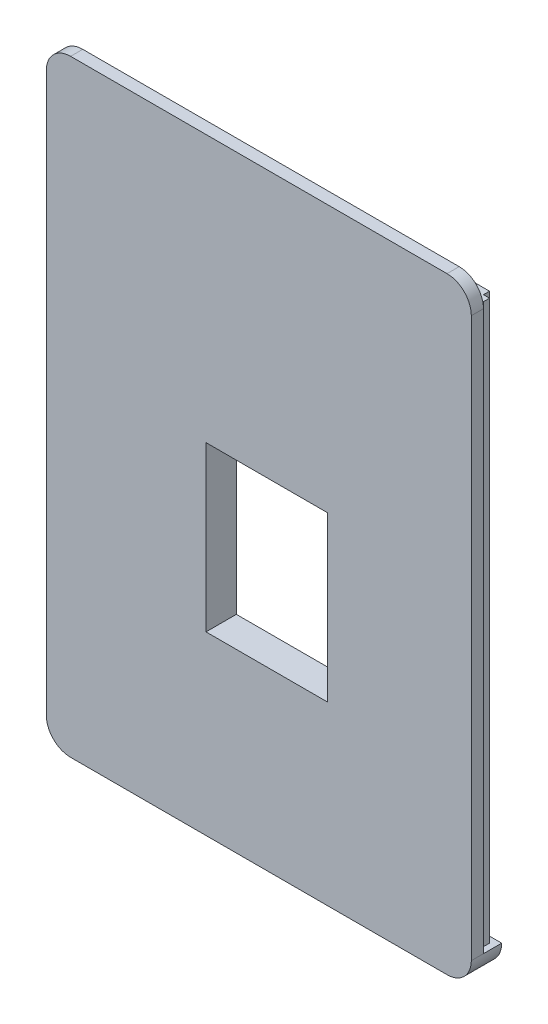
ISO-10303-21;
HEADER;
FILE_DESCRIPTION(('STEP AP214'),'2;1');
FILE_NAME('part.step','',(''),(''),'','','');
FILE_SCHEMA(('AUTOMOTIVE_DESIGN { 1 0 10303 214 1 1 1 1 }'));
ENDSEC;
DATA;
#1=APPLICATION_CONTEXT('core data for automotive mechanical design processes');
#2=APPLICATION_PROTOCOL_DEFINITION('international standard','automotive_design',2000,#1);
#3=PRODUCT_CONTEXT('',#1,'mechanical');
#4=PRODUCT('Part','Part','',(#3));
#5=PRODUCT_RELATED_PRODUCT_CATEGORY('part','',(#4));
#6=PRODUCT_DEFINITION_FORMATION('','',#4);
#7=PRODUCT_DEFINITION_CONTEXT('part definition',#1,'design');
#8=PRODUCT_DEFINITION('design','',#6,#7);
#9=PRODUCT_DEFINITION_SHAPE('','',#8);
#10=(LENGTH_UNIT() NAMED_UNIT(*) SI_UNIT(.MILLI.,.METRE.));
#11=(NAMED_UNIT(*) PLANE_ANGLE_UNIT() SI_UNIT($,.RADIAN.));
#12=(NAMED_UNIT(*) SI_UNIT($,.STERADIAN.) SOLID_ANGLE_UNIT());
#13=UNCERTAINTY_MEASURE_WITH_UNIT(LENGTH_MEASURE(1.E-05),#10,'distance_accuracy_value','');
#14=(GEOMETRIC_REPRESENTATION_CONTEXT(3) GLOBAL_UNCERTAINTY_ASSIGNED_CONTEXT((#13)) GLOBAL_UNIT_ASSIGNED_CONTEXT((#10,
#11,#12)) REPRESENTATION_CONTEXT('',''));
#15=CARTESIAN_POINT('',(0.,0.,0.));
#16=DIRECTION('',(0.,0.,1.));
#17=DIRECTION('',(1.,0.,0.));
#18=AXIS2_PLACEMENT_3D('',#15,#16,#17);
#19=CARTESIAN_POINT('',(0.,0.,0.));
#20=DIRECTION('',(0.,0.,-1.));
#21=DIRECTION('',(-1.,0.,0.));
#22=AXIS2_PLACEMENT_3D('',#19,#20,#21);
#23=PLANE('',#22);
#24=DIRECTION('',(0.,-1.,0.));
#25=VECTOR('',#24,1.);
#26=CARTESIAN_POINT('',(11.3,6.05,0.));
#27=LINE('',#26,#25);
#28=CARTESIAN_POINT('',(11.3,6.05,0.));
#29=VERTEX_POINT('',#28);
#30=CARTESIAN_POINT('',(11.3,-20.95,0.));
#31=VERTEX_POINT('',#30);
#32=EDGE_CURVE('E306',#29,#31,#27,.T.);
#33=ORIENTED_EDGE('',*,*,#32,.F.);
#34=DIRECTION('',(1.,0.,0.));
#35=VECTOR('',#34,1.);
#36=CARTESIAN_POINT('',(-8.7,6.05,0.));
#37=LINE('',#36,#35);
#38=CARTESIAN_POINT('',(-8.7,6.05,0.));
#39=VERTEX_POINT('',#38);
#40=EDGE_CURVE('E294',#39,#29,#37,.T.);
#41=ORIENTED_EDGE('',*,*,#40,.F.);
#42=DIRECTION('',(0.,1.,0.));
#43=VECTOR('',#42,1.);
#44=CARTESIAN_POINT('',(-8.7,6.05,0.));
#45=LINE('',#44,#43);
#46=CARTESIAN_POINT('',(-8.7,-20.95,0.));
#47=VERTEX_POINT('',#46);
#48=EDGE_CURVE('E314',#47,#39,#45,.T.);
#49=ORIENTED_EDGE('',*,*,#48,.F.);
#50=DIRECTION('',(-1.,0.,0.));
#51=VECTOR('',#50,1.);
#52=CARTESIAN_POINT('',(-8.7,-20.95,0.));
#53=LINE('',#52,#51);
#54=EDGE_CURVE('E309',#31,#47,#53,.T.);
#55=ORIENTED_EDGE('',*,*,#54,.F.);
#56=EDGE_LOOP('',(#33,#41,#49,#55));
#57=FACE_BOUND('',#56,.T.);
#58=DIRECTION('',(0.,1.,0.));
#59=VECTOR('',#58,1.);
#60=CARTESIAN_POINT('',(-33.,-46.,0.));
#61=LINE('',#60,#59);
#62=CARTESIAN_POINT('',(-33.,-46.,0.));
#63=VERTEX_POINT('',#62);
#64=CARTESIAN_POINT('',(-33.,46.,0.));
#65=VERTEX_POINT('',#64);
#66=EDGE_CURVE('E260',#63,#65,#61,.T.);
#67=ORIENTED_EDGE('',*,*,#66,.T.);
#68=DIRECTION('',(-1.,0.,0.));
#69=VECTOR('',#68,1.);
#70=CARTESIAN_POINT('',(35.,46.,0.));
#71=LINE('',#70,#69);
#72=CARTESIAN_POINT('',(33.,46.,0.));
#73=VERTEX_POINT('',#72);
#74=EDGE_CURVE('E230',#73,#65,#71,.T.);
#75=ORIENTED_EDGE('',*,*,#74,.F.);
#76=DIRECTION('',(0.,1.,0.));
#77=VECTOR('',#76,1.);
#78=CARTESIAN_POINT('',(33.,-46.,0.));
#79=LINE('',#78,#77);
#80=CARTESIAN_POINT('',(33.,-46.,0.));
#81=VERTEX_POINT('',#80);
#82=EDGE_CURVE('E445',#81,#73,#79,.T.);
#83=ORIENTED_EDGE('',*,*,#82,.F.);
#84=DIRECTION('',(-1.,0.,0.));
#85=VECTOR('',#84,1.);
#86=CARTESIAN_POINT('',(35.,-46.,0.));
#87=LINE('',#86,#85);
#88=CARTESIAN_POINT('',(35.,-46.,0.));
#89=VERTEX_POINT('',#88);
#90=EDGE_CURVE('E466',#89,#81,#87,.T.);
#91=ORIENTED_EDGE('',*,*,#90,.F.);
#92=CARTESIAN_POINT('',(31.,-46.,0.));
#93=DIRECTION('',(0.,0.,-1.));
#94=DIRECTION('',(-1.,0.,0.));
#95=AXIS2_PLACEMENT_3D('',#92,#93,#94);
#96=CIRCLE('',#95,4.);
#97=CARTESIAN_POINT('',(31.,-50.,0.));
#98=VERTEX_POINT('',#97);
#99=EDGE_CURVE('E360',#89,#98,#96,.T.);
#100=ORIENTED_EDGE('',*,*,#99,.T.);
#101=DIRECTION('',(1.,0.,0.));
#102=VECTOR('',#101,1.);
#103=CARTESIAN_POINT('',(35.,-50.,0.));
#104=LINE('',#103,#102);
#105=CARTESIAN_POINT('',(-31.,-50.,0.));
#106=VERTEX_POINT('',#105);
#107=EDGE_CURVE('E324',#106,#98,#104,.T.);
#108=ORIENTED_EDGE('',*,*,#107,.F.);
#109=CARTESIAN_POINT('',(-31.,-46.,0.));
#110=DIRECTION('',(0.,0.,-1.));
#111=DIRECTION('',(-1.,0.,0.));
#112=AXIS2_PLACEMENT_3D('',#109,#110,#111);
#113=CIRCLE('',#112,4.);
#114=CARTESIAN_POINT('',(-35.,-46.,0.));
#115=VERTEX_POINT('',#114);
#116=EDGE_CURVE('E363',#106,#115,#113,.T.);
#117=ORIENTED_EDGE('',*,*,#116,.T.);
#118=DIRECTION('',(-1.,0.,0.));
#119=VECTOR('',#118,1.);
#120=CARTESIAN_POINT('',(-35.,-46.,0.));
#121=LINE('',#120,#119);
#122=EDGE_CURVE('E285',#63,#115,#121,.T.);
#123=ORIENTED_EDGE('',*,*,#122,.F.);
#124=EDGE_LOOP('',(#67,#75,#83,#91,#100,#108,#117,#123));
#125=FACE_BOUND('',#124,.T.);
#126=ADVANCED_FACE('F45',(#57,#125),#23,.T.);
#127=CARTESIAN_POINT('',(-33.,-46.,0.));
#128=DIRECTION('',(1.,0.,0.));
#129=DIRECTION('',(0.,0.,-1.));
#130=AXIS2_PLACEMENT_3D('',#127,#128,#129);
#131=PLANE('',#130);
#132=DIRECTION('',(0.,0.,1.));
#133=VECTOR('',#132,1.);
#134=CARTESIAN_POINT('',(-33.,46.,0.));
#135=LINE('',#134,#133);
#136=CARTESIAN_POINT('',(-33.,46.,1.));
#137=VERTEX_POINT('',#136);
#138=EDGE_CURVE('E264',#65,#137,#135,.T.);
#139=ORIENTED_EDGE('',*,*,#138,.F.);
#140=ORIENTED_EDGE('',*,*,#66,.F.);
#141=DIRECTION('',(0.,0.,-1.));
#142=VECTOR('',#141,1.);
#143=CARTESIAN_POINT('',(-33.,-46.,0.));
#144=LINE('',#143,#142);
#145=CARTESIAN_POINT('',(-33.,-46.,1.));
#146=VERTEX_POINT('',#145);
#147=EDGE_CURVE('E242',#146,#63,#144,.T.);
#148=ORIENTED_EDGE('',*,*,#147,.F.);
#149=DIRECTION('',(0.,1.,0.));
#150=VECTOR('',#149,1.);
#151=CARTESIAN_POINT('',(-33.,-46.,1.));
#152=LINE('',#151,#150);
#153=EDGE_CURVE('E256',#146,#137,#152,.T.);
#154=ORIENTED_EDGE('',*,*,#153,.T.);
#155=EDGE_LOOP('',(#139,#140,#148,#154));
#156=FACE_BOUND('',#155,.T.);
#157=ADVANCED_FACE('F552',(#156),#131,.F.);
#158=CARTESIAN_POINT('',(-33.,-46.,1.));
#159=DIRECTION('',(0.,0.,1.));
#160=DIRECTION('',(1.,0.,0.));
#161=AXIS2_PLACEMENT_3D('',#158,#159,#160);
#162=PLANE('',#161);
#163=DIRECTION('',(-1.,0.,0.));
#164=VECTOR('',#163,1.);
#165=CARTESIAN_POINT('',(-33.,46.,1.));
#166=LINE('',#165,#164);
#167=CARTESIAN_POINT('',(-34.,46.,1.));
#168=VERTEX_POINT('',#167);
#169=EDGE_CURVE('E458',#137,#168,#166,.T.);
#170=ORIENTED_EDGE('',*,*,#169,.F.);
#171=ORIENTED_EDGE('',*,*,#153,.F.);
#172=DIRECTION('',(1.,0.,0.));
#173=VECTOR('',#172,1.);
#174=CARTESIAN_POINT('',(-33.,-46.,1.));
#175=LINE('',#174,#173);
#176=CARTESIAN_POINT('',(-34.,-46.,1.));
#177=VERTEX_POINT('',#176);
#178=EDGE_CURVE('E268',#177,#146,#175,.T.);
#179=ORIENTED_EDGE('',*,*,#178,.F.);
#180=DIRECTION('',(0.,1.,0.));
#181=VECTOR('',#180,1.);
#182=CARTESIAN_POINT('',(-34.,-46.,1.));
#183=LINE('',#182,#181);
#184=EDGE_CURVE('E252',#177,#168,#183,.T.);
#185=ORIENTED_EDGE('',*,*,#184,.T.);
#186=EDGE_LOOP('',(#170,#171,#179,#185));
#187=FACE_BOUND('',#186,.T.);
#188=ADVANCED_FACE('F556',(#187),#162,.F.);
#189=CARTESIAN_POINT('',(-34.,-46.,2.));
#190=DIRECTION('',(1.,0.,0.));
#191=DIRECTION('',(0.,0.,-1.));
#192=AXIS2_PLACEMENT_3D('',#189,#190,#191);
#193=PLANE('',#192);
#194=DIRECTION('',(0.,0.,1.));
#195=VECTOR('',#194,1.);
#196=CARTESIAN_POINT('',(-34.,46.,2.));
#197=LINE('',#196,#195);
#198=CARTESIAN_POINT('',(-34.,46.,2.));
#199=VERTEX_POINT('',#198);
#200=EDGE_CURVE('E459',#168,#199,#197,.T.);
#201=ORIENTED_EDGE('',*,*,#200,.F.);
#202=ORIENTED_EDGE('',*,*,#184,.F.);
#203=DIRECTION('',(0.,0.,-1.));
#204=VECTOR('',#203,1.);
#205=CARTESIAN_POINT('',(-34.,-46.,2.));
#206=LINE('',#205,#204);
#207=CARTESIAN_POINT('',(-34.,-46.,2.));
#208=VERTEX_POINT('',#207);
#209=EDGE_CURVE('E272',#208,#177,#206,.T.);
#210=ORIENTED_EDGE('',*,*,#209,.F.);
#211=DIRECTION('',(0.,1.,0.));
#212=VECTOR('',#211,1.);
#213=CARTESIAN_POINT('',(-34.,-46.,2.));
#214=LINE('',#213,#212);
#215=EDGE_CURVE('E245',#208,#199,#214,.T.);
#216=ORIENTED_EDGE('',*,*,#215,.T.);
#217=EDGE_LOOP('',(#201,#202,#210,#216));
#218=FACE_BOUND('',#217,.T.);
#219=ADVANCED_FACE('F559',(#218),#193,.F.);
#220=CARTESIAN_POINT('',(-33.,-46.,2.));
#221=DIRECTION('',(0.,0.,-1.));
#222=DIRECTION('',(-1.,0.,0.));
#223=AXIS2_PLACEMENT_3D('',#220,#221,#222);
#224=PLANE('',#223);
#225=DIRECTION('',(1.,0.,0.));
#226=VECTOR('',#225,1.);
#227=CARTESIAN_POINT('',(-33.,46.,2.));
#228=LINE('',#227,#226);
#229=CARTESIAN_POINT('',(-33.,46.,2.));
#230=VERTEX_POINT('',#229);
#231=EDGE_CURVE('E216',#199,#230,#228,.T.);
#232=ORIENTED_EDGE('',*,*,#231,.F.);
#233=ORIENTED_EDGE('',*,*,#215,.F.);
#234=DIRECTION('',(-1.,0.,0.));
#235=VECTOR('',#234,1.);
#236=CARTESIAN_POINT('',(-33.,-46.,2.));
#237=LINE('',#236,#235);
#238=CARTESIAN_POINT('',(-33.,-46.,2.));
#239=VERTEX_POINT('',#238);
#240=EDGE_CURVE('E276',#239,#208,#237,.T.);
#241=ORIENTED_EDGE('',*,*,#240,.F.);
#242=DIRECTION('',(0.,1.,0.));
#243=VECTOR('',#242,1.);
#244=CARTESIAN_POINT('',(-33.,-46.,2.));
#245=LINE('',#244,#243);
#246=EDGE_CURVE('E237',#239,#230,#245,.T.);
#247=ORIENTED_EDGE('',*,*,#246,.T.);
#248=EDGE_LOOP('',(#232,#233,#241,#247));
#249=FACE_BOUND('',#248,.T.);
#250=ADVANCED_FACE('F561',(#249),#224,.F.);
#251=CARTESIAN_POINT('',(-33.,-46.,2.));
#252=DIRECTION('',(1.,0.,0.));
#253=DIRECTION('',(0.,0.,-1.));
#254=AXIS2_PLACEMENT_3D('',#251,#252,#253);
#255=PLANE('',#254);
#256=DIRECTION('',(0.,0.,1.));
#257=VECTOR('',#256,1.);
#258=CARTESIAN_POINT('',(-33.,46.,2.));
#259=LINE('',#258,#257);
#260=CARTESIAN_POINT('',(-33.,46.,3.));
#261=VERTEX_POINT('',#260);
#262=EDGE_CURVE('E210',#230,#261,#259,.T.);
#263=ORIENTED_EDGE('',*,*,#262,.F.);
#264=ORIENTED_EDGE('',*,*,#246,.F.);
#265=DIRECTION('',(0.,0.,-1.));
#266=VECTOR('',#265,1.);
#267=CARTESIAN_POINT('',(-33.,-46.,2.));
#268=LINE('',#267,#266);
#269=CARTESIAN_POINT('',(-33.,-46.,3.));
#270=VERTEX_POINT('',#269);
#271=EDGE_CURVE('E234',#270,#239,#268,.T.);
#272=ORIENTED_EDGE('',*,*,#271,.F.);
#273=DIRECTION('',(0.,1.,0.));
#274=VECTOR('',#273,1.);
#275=CARTESIAN_POINT('',(-33.,-46.,3.));
#276=LINE('',#275,#274);
#277=EDGE_CURVE('E225',#270,#261,#276,.T.);
#278=ORIENTED_EDGE('',*,*,#277,.T.);
#279=EDGE_LOOP('',(#263,#264,#272,#278));
#280=FACE_BOUND('',#279,.T.);
#281=ADVANCED_FACE('F232',(#280),#255,.F.);
#282=CARTESIAN_POINT('',(33.,-46.,2.));
#283=DIRECTION('',(-1.,0.,0.));
#284=DIRECTION('',(0.,0.,1.));
#285=AXIS2_PLACEMENT_3D('',#282,#283,#284);
#286=PLANE('',#285);
#287=DIRECTION('',(0.,0.,-1.));
#288=VECTOR('',#287,1.);
#289=CARTESIAN_POINT('',(33.,46.,2.));
#290=LINE('',#289,#288);
#291=CARTESIAN_POINT('',(33.,46.,3.));
#292=VERTEX_POINT('',#291);
#293=CARTESIAN_POINT('',(33.,46.,2.));
#294=VERTEX_POINT('',#293);
#295=EDGE_CURVE('E221',#292,#294,#290,.T.);
#296=ORIENTED_EDGE('',*,*,#295,.F.);
#297=DIRECTION('',(0.,1.,0.));
#298=VECTOR('',#297,1.);
#299=CARTESIAN_POINT('',(33.,-46.,3.));
#300=LINE('',#299,#298);
#301=CARTESIAN_POINT('',(33.,-46.,3.));
#302=VERTEX_POINT('',#301);
#303=EDGE_CURVE('E228',#302,#292,#300,.T.);
#304=ORIENTED_EDGE('',*,*,#303,.F.);
#305=DIRECTION('',(0.,0.,1.));
#306=VECTOR('',#305,1.);
#307=CARTESIAN_POINT('',(33.,-46.,2.));
#308=LINE('',#307,#306);
#309=CARTESIAN_POINT('',(33.,-46.,2.));
#310=VERTEX_POINT('',#309);
#311=EDGE_CURVE('E446',#310,#302,#308,.T.);
#312=ORIENTED_EDGE('',*,*,#311,.F.);
#313=DIRECTION('',(0.,1.,0.));
#314=VECTOR('',#313,1.);
#315=CARTESIAN_POINT('',(33.,-46.,2.));
#316=LINE('',#315,#314);
#317=EDGE_CURVE('E462',#310,#294,#316,.T.);
#318=ORIENTED_EDGE('',*,*,#317,.T.);
#319=EDGE_LOOP('',(#296,#304,#312,#318));
#320=FACE_BOUND('',#319,.T.);
#321=ADVANCED_FACE('F535',(#320),#286,.F.);
#322=CARTESIAN_POINT('',(34.,-46.,2.));
#323=DIRECTION('',(0.,0.,-1.));
#324=DIRECTION('',(-1.,0.,0.));
#325=AXIS2_PLACEMENT_3D('',#322,#323,#324);
#326=PLANE('',#325);
#327=DIRECTION('',(1.,0.,0.));
#328=VECTOR('',#327,1.);
#329=CARTESIAN_POINT('',(34.,46.,2.));
#330=LINE('',#329,#328);
#331=CARTESIAN_POINT('',(34.,46.,2.));
#332=VERTEX_POINT('',#331);
#333=EDGE_CURVE('E440',#294,#332,#330,.T.);
#334=ORIENTED_EDGE('',*,*,#333,.F.);
#335=ORIENTED_EDGE('',*,*,#317,.F.);
#336=DIRECTION('',(-1.,0.,0.));
#337=VECTOR('',#336,1.);
#338=CARTESIAN_POINT('',(34.,-46.,2.));
#339=LINE('',#338,#337);
#340=CARTESIAN_POINT('',(34.,-46.,2.));
#341=VERTEX_POINT('',#340);
#342=EDGE_CURVE('E471',#341,#310,#339,.T.);
#343=ORIENTED_EDGE('',*,*,#342,.F.);
#344=DIRECTION('',(0.,1.,0.));
#345=VECTOR('',#344,1.);
#346=CARTESIAN_POINT('',(34.,-46.,2.));
#347=LINE('',#346,#345);
#348=EDGE_CURVE('E454',#341,#332,#347,.T.);
#349=ORIENTED_EDGE('',*,*,#348,.T.);
#350=EDGE_LOOP('',(#334,#335,#343,#349));
#351=FACE_BOUND('',#350,.T.);
#352=ADVANCED_FACE('F532',(#351),#326,.F.);
#353=CARTESIAN_POINT('',(34.,-46.,2.));
#354=DIRECTION('',(-1.,0.,0.));
#355=DIRECTION('',(0.,0.,1.));
#356=AXIS2_PLACEMENT_3D('',#353,#354,#355);
#357=PLANE('',#356);
#358=DIRECTION('',(0.,0.,-1.));
#359=VECTOR('',#358,1.);
#360=CARTESIAN_POINT('',(34.,46.,2.));
#361=LINE('',#360,#359);
#362=CARTESIAN_POINT('',(34.,46.,1.));
#363=VERTEX_POINT('',#362);
#364=EDGE_CURVE('E439',#332,#363,#361,.T.);
#365=ORIENTED_EDGE('',*,*,#364,.F.);
#366=ORIENTED_EDGE('',*,*,#348,.F.);
#367=DIRECTION('',(0.,0.,1.));
#368=VECTOR('',#367,1.);
#369=CARTESIAN_POINT('',(34.,-46.,2.));
#370=LINE('',#369,#368);
#371=CARTESIAN_POINT('',(34.,-46.,1.));
#372=VERTEX_POINT('',#371);
#373=EDGE_CURVE('E473',#372,#341,#370,.T.);
#374=ORIENTED_EDGE('',*,*,#373,.F.);
#375=DIRECTION('',(0.,1.,0.));
#376=VECTOR('',#375,1.);
#377=CARTESIAN_POINT('',(34.,-46.,1.));
#378=LINE('',#377,#376);
#379=EDGE_CURVE('E452',#372,#363,#378,.T.);
#380=ORIENTED_EDGE('',*,*,#379,.T.);
#381=EDGE_LOOP('',(#365,#366,#374,#380));
#382=FACE_BOUND('',#381,.T.);
#383=ADVANCED_FACE('F529',(#382),#357,.F.);
#384=CARTESIAN_POINT('',(34.,-46.,1.));
#385=DIRECTION('',(0.,0.,1.));
#386=DIRECTION('',(1.,0.,0.));
#387=AXIS2_PLACEMENT_3D('',#384,#385,#386);
#388=PLANE('',#387);
#389=DIRECTION('',(-1.,0.,0.));
#390=VECTOR('',#389,1.);
#391=CARTESIAN_POINT('',(34.,46.,1.));
#392=LINE('',#391,#390);
#393=CARTESIAN_POINT('',(33.,46.,1.));
#394=VERTEX_POINT('',#393);
#395=EDGE_CURVE('E60',#363,#394,#392,.T.);
#396=ORIENTED_EDGE('',*,*,#395,.F.);
#397=ORIENTED_EDGE('',*,*,#379,.F.);
#398=DIRECTION('',(1.,0.,0.));
#399=VECTOR('',#398,1.);
#400=CARTESIAN_POINT('',(34.,-46.,1.));
#401=LINE('',#400,#399);
#402=CARTESIAN_POINT('',(33.,-46.,1.));
#403=VERTEX_POINT('',#402);
#404=EDGE_CURVE('E482',#403,#372,#401,.T.);
#405=ORIENTED_EDGE('',*,*,#404,.F.);
#406=DIRECTION('',(0.,1.,0.));
#407=VECTOR('',#406,1.);
#408=CARTESIAN_POINT('',(33.,-46.,1.));
#409=LINE('',#408,#407);
#410=EDGE_CURVE('E455',#403,#394,#409,.T.);
#411=ORIENTED_EDGE('',*,*,#410,.T.);
#412=EDGE_LOOP('',(#396,#397,#405,#411));
#413=FACE_BOUND('',#412,.T.);
#414=ADVANCED_FACE('F526',(#413),#388,.F.);
#415=CARTESIAN_POINT('',(33.,-46.,1.));
#416=DIRECTION('',(-1.,0.,0.));
#417=DIRECTION('',(0.,0.,1.));
#418=AXIS2_PLACEMENT_3D('',#415,#416,#417);
#419=PLANE('',#418);
#420=DIRECTION('',(0.,0.,-1.));
#421=VECTOR('',#420,1.);
#422=CARTESIAN_POINT('',(33.,46.,1.));
#423=LINE('',#422,#421);
#424=EDGE_CURVE('E11',#394,#73,#423,.T.);
#425=ORIENTED_EDGE('',*,*,#424,.F.);
#426=ORIENTED_EDGE('',*,*,#410,.F.);
#427=DIRECTION('',(0.,0.,1.));
#428=VECTOR('',#427,1.);
#429=CARTESIAN_POINT('',(33.,-46.,1.));
#430=LINE('',#429,#428);
#431=EDGE_CURVE('E468',#81,#403,#430,.T.);
#432=ORIENTED_EDGE('',*,*,#431,.F.);
#433=ORIENTED_EDGE('',*,*,#82,.T.);
#434=EDGE_LOOP('',(#425,#426,#432,#433));
#435=FACE_BOUND('',#434,.T.);
#436=ADVANCED_FACE('F497',(#435),#419,.F.);
#437=CARTESIAN_POINT('',(35.,50.,5.));
#438=DIRECTION('',(0.,-1.,0.));
#439=DIRECTION('',(0.,0.,-1.));
#440=AXIS2_PLACEMENT_3D('',#437,#438,#439);
#441=PLANE('',#440);
#442=DIRECTION('',(0.,0.,-1.));
#443=VECTOR('',#442,1.);
#444=CARTESIAN_POINT('',(31.,50.,5.));
#445=LINE('',#444,#443);
#446=CARTESIAN_POINT('',(31.,50.,5.));
#447=VERTEX_POINT('',#446);
#448=CARTESIAN_POINT('',(31.,50.,3.));
#449=VERTEX_POINT('',#448);
#450=EDGE_CURVE('E398',#447,#449,#445,.T.);
#451=ORIENTED_EDGE('',*,*,#450,.T.);
#452=DIRECTION('',(1.,0.,0.));
#453=VECTOR('',#452,1.);
#454=CARTESIAN_POINT('',(35.,50.,3.));
#455=LINE('',#454,#453);
#456=CARTESIAN_POINT('',(-31.,50.,3.));
#457=VERTEX_POINT('',#456);
#458=EDGE_CURVE('E409',#457,#449,#455,.T.);
#459=ORIENTED_EDGE('',*,*,#458,.F.);
#460=DIRECTION('',(0.,0.,-1.));
#461=VECTOR('',#460,1.);
#462=CARTESIAN_POINT('',(-31.,50.,5.));
#463=LINE('',#462,#461);
#464=CARTESIAN_POINT('',(-31.,50.,5.));
#465=VERTEX_POINT('',#464);
#466=EDGE_CURVE('E395',#457,#465,#463,.F.);
#467=ORIENTED_EDGE('',*,*,#466,.T.);
#468=DIRECTION('',(-1.,0.,0.));
#469=VECTOR('',#468,1.);
#470=CARTESIAN_POINT('',(35.,50.,5.));
#471=LINE('',#470,#469);
#472=EDGE_CURVE('E334',#447,#465,#471,.T.);
#473=ORIENTED_EDGE('',*,*,#472,.F.);
#474=EDGE_LOOP('',(#451,#459,#467,#473));
#475=FACE_BOUND('',#474,.T.);
#476=ADVANCED_FACE('F426',(#475),#441,.F.);
#477=CARTESIAN_POINT('',(-35.,-50.,5.));
#478=DIRECTION('',(1.,0.,0.));
#479=DIRECTION('',(0.,0.,-1.));
#480=AXIS2_PLACEMENT_3D('',#477,#478,#479);
#481=PLANE('',#480);
#482=DIRECTION('',(0.,0.,-1.));
#483=VECTOR('',#482,1.);
#484=CARTESIAN_POINT('',(-35.,46.,5.));
#485=LINE('',#484,#483);
#486=CARTESIAN_POINT('',(-35.,46.,5.));
#487=VERTEX_POINT('',#486);
#488=CARTESIAN_POINT('',(-35.,46.,3.));
#489=VERTEX_POINT('',#488);
#490=EDGE_CURVE('E367',#487,#489,#485,.T.);
#491=ORIENTED_EDGE('',*,*,#490,.T.);
#492=DIRECTION('',(0.,1.,0.));
#493=VECTOR('',#492,1.);
#494=CARTESIAN_POINT('',(-35.,-46.,3.));
#495=LINE('',#494,#493);
#496=CARTESIAN_POINT('',(-35.,-46.,3.));
#497=VERTEX_POINT('',#496);
#498=EDGE_CURVE('E68',#497,#489,#495,.T.);
#499=ORIENTED_EDGE('',*,*,#498,.F.);
#500=DIRECTION('',(0.,0.,-1.));
#501=VECTOR('',#500,1.);
#502=CARTESIAN_POINT('',(-35.,-46.,5.));
#503=LINE('',#502,#501);
#504=CARTESIAN_POINT('',(-35.,-46.,5.));
#505=VERTEX_POINT('',#504);
#506=EDGE_CURVE('E371',#497,#505,#503,.F.);
#507=ORIENTED_EDGE('',*,*,#506,.T.);
#508=DIRECTION('',(0.,-1.,0.));
#509=VECTOR('',#508,1.);
#510=CARTESIAN_POINT('',(-35.,-50.,5.));
#511=LINE('',#510,#509);
#512=EDGE_CURVE('E338',#487,#505,#511,.T.);
#513=ORIENTED_EDGE('',*,*,#512,.F.);
#514=EDGE_LOOP('',(#491,#499,#507,#513));
#515=FACE_BOUND('',#514,.T.);
#516=ADVANCED_FACE('F433',(#515),#481,.F.);
#517=CARTESIAN_POINT('',(35.,-50.,5.));
#518=DIRECTION('',(0.,1.,0.));
#519=DIRECTION('',(0.,0.,1.));
#520=AXIS2_PLACEMENT_3D('',#517,#518,#519);
#521=PLANE('',#520);
#522=DIRECTION('',(1.,0.,0.));
#523=VECTOR('',#522,1.);
#524=CARTESIAN_POINT('',(35.,-50.,5.));
#525=LINE('',#524,#523);
#526=CARTESIAN_POINT('',(-31.,-50.,5.));
#527=VERTEX_POINT('',#526);
#528=CARTESIAN_POINT('',(31.,-50.,5.));
#529=VERTEX_POINT('',#528);
#530=EDGE_CURVE('E342',#527,#529,#525,.T.);
#531=ORIENTED_EDGE('',*,*,#530,.F.);
#532=DIRECTION('',(0.,0.,-1.));
#533=VECTOR('',#532,1.);
#534=CARTESIAN_POINT('',(-31.,-50.,5.));
#535=LINE('',#534,#533);
#536=EDGE_CURVE('E356',#527,#106,#535,.T.);
#537=ORIENTED_EDGE('',*,*,#536,.T.);
#538=ORIENTED_EDGE('',*,*,#107,.T.);
#539=DIRECTION('',(0.,0.,-1.));
#540=VECTOR('',#539,1.);
#541=CARTESIAN_POINT('',(31.,-50.,5.));
#542=LINE('',#541,#540);
#543=EDGE_CURVE('E350',#98,#529,#542,.F.);
#544=ORIENTED_EDGE('',*,*,#543,.T.);
#545=EDGE_LOOP('',(#531,#537,#538,#544));
#546=FACE_BOUND('',#545,.T.);
#547=ADVANCED_FACE('F544',(#546),#521,.F.);
#548=CARTESIAN_POINT('',(35.,-50.,5.));
#549=DIRECTION('',(-1.,0.,0.));
#550=DIRECTION('',(0.,0.,1.));
#551=AXIS2_PLACEMENT_3D('',#548,#549,#550);
#552=PLANE('',#551);
#553=DIRECTION('',(0.,0.,-1.));
#554=VECTOR('',#553,1.);
#555=CARTESIAN_POINT('',(35.,-46.,5.));
#556=LINE('',#555,#554);
#557=CARTESIAN_POINT('',(35.,-46.,5.));
#558=VERTEX_POINT('',#557);
#559=CARTESIAN_POINT('',(35.,-46.,3.));
#560=VERTEX_POINT('',#559);
#561=EDGE_CURVE('E391',#558,#560,#556,.T.);
#562=ORIENTED_EDGE('',*,*,#561,.T.);
#563=DIRECTION('',(0.,1.,0.));
#564=VECTOR('',#563,1.);
#565=CARTESIAN_POINT('',(35.,-46.,3.));
#566=LINE('',#565,#564);
#567=CARTESIAN_POINT('',(35.,46.,3.));
#568=VERTEX_POINT('',#567);
#569=EDGE_CURVE('E310',#560,#568,#566,.T.);
#570=ORIENTED_EDGE('',*,*,#569,.T.);
#571=DIRECTION('',(0.,0.,-1.));
#572=VECTOR('',#571,1.);
#573=CARTESIAN_POINT('',(35.,46.,5.));
#574=LINE('',#573,#572);
#575=CARTESIAN_POINT('',(35.,46.,5.));
#576=VERTEX_POINT('',#575);
#577=EDGE_CURVE('E388',#568,#576,#574,.F.);
#578=ORIENTED_EDGE('',*,*,#577,.T.);
#579=DIRECTION('',(0.,1.,0.));
#580=VECTOR('',#579,1.);
#581=CARTESIAN_POINT('',(35.,-50.,5.));
#582=LINE('',#581,#580);
#583=EDGE_CURVE('E346',#558,#576,#582,.T.);
#584=ORIENTED_EDGE('',*,*,#583,.F.);
#585=EDGE_LOOP('',(#562,#570,#578,#584));
#586=FACE_BOUND('',#585,.T.);
#587=ADVANCED_FACE('F414',(#586),#552,.F.);
#588=CARTESIAN_POINT('',(0.,0.,5.));
#589=DIRECTION('',(0.,0.,-1.));
#590=DIRECTION('',(-1.,0.,0.));
#591=AXIS2_PLACEMENT_3D('',#588,#589,#590);
#592=PLANE('',#591);
#593=DIRECTION('',(1.,0.,0.));
#594=VECTOR('',#593,1.);
#595=CARTESIAN_POINT('',(-8.7,6.05,5.));
#596=LINE('',#595,#594);
#597=CARTESIAN_POINT('',(-8.7,6.05,5.));
#598=VERTEX_POINT('',#597);
#599=CARTESIAN_POINT('',(11.3,6.05,5.));
#600=VERTEX_POINT('',#599);
#601=EDGE_CURVE('E301',#598,#600,#596,.T.);
#602=ORIENTED_EDGE('',*,*,#601,.T.);
#603=DIRECTION('',(0.,-1.,0.));
#604=VECTOR('',#603,1.);
#605=CARTESIAN_POINT('',(11.3,6.05,5.));
#606=LINE('',#605,#604);
#607=CARTESIAN_POINT('',(11.3,-20.95,5.));
#608=VERTEX_POINT('',#607);
#609=EDGE_CURVE('E289',#600,#608,#606,.T.);
#610=ORIENTED_EDGE('',*,*,#609,.T.);
#611=DIRECTION('',(-1.,0.,0.));
#612=VECTOR('',#611,1.);
#613=CARTESIAN_POINT('',(-8.7,-20.95,5.));
#614=LINE('',#613,#612);
#615=CARTESIAN_POINT('',(-8.7,-20.95,5.));
#616=VERTEX_POINT('',#615);
#617=EDGE_CURVE('E293',#608,#616,#614,.T.);
#618=ORIENTED_EDGE('',*,*,#617,.T.);
#619=DIRECTION('',(0.,1.,0.));
#620=VECTOR('',#619,1.);
#621=CARTESIAN_POINT('',(-8.7,6.05,5.));
#622=LINE('',#621,#620);
#623=EDGE_CURVE('E297',#616,#598,#622,.T.);
#624=ORIENTED_EDGE('',*,*,#623,.T.);
#625=EDGE_LOOP('',(#602,#610,#618,#624));
#626=FACE_BOUND('',#625,.T.);
#627=ORIENTED_EDGE('',*,*,#512,.T.);
#628=CARTESIAN_POINT('',(-31.,-46.,5.));
#629=DIRECTION('',(0.,0.,-1.));
#630=DIRECTION('',(-1.,0.,0.));
#631=AXIS2_PLACEMENT_3D('',#628,#629,#630);
#632=CIRCLE('',#631,4.);
#633=EDGE_CURVE('E385',#505,#527,#632,.F.);
#634=ORIENTED_EDGE('',*,*,#633,.T.);
#635=ORIENTED_EDGE('',*,*,#530,.T.);
#636=CARTESIAN_POINT('',(31.,-46.,5.));
#637=DIRECTION('',(0.,0.,-1.));
#638=DIRECTION('',(-1.,0.,0.));
#639=AXIS2_PLACEMENT_3D('',#636,#637,#638);
#640=CIRCLE('',#639,4.);
#641=EDGE_CURVE('E382',#529,#558,#640,.F.);
#642=ORIENTED_EDGE('',*,*,#641,.T.);
#643=ORIENTED_EDGE('',*,*,#583,.T.);
#644=CARTESIAN_POINT('',(31.,46.,5.));
#645=DIRECTION('',(0.,0.,-1.));
#646=DIRECTION('',(-1.,0.,0.));
#647=AXIS2_PLACEMENT_3D('',#644,#645,#646);
#648=CIRCLE('',#647,4.);
#649=EDGE_CURVE('E379',#576,#447,#648,.F.);
#650=ORIENTED_EDGE('',*,*,#649,.T.);
#651=ORIENTED_EDGE('',*,*,#472,.T.);
#652=CARTESIAN_POINT('',(-31.,46.,5.));
#653=DIRECTION('',(0.,0.,-1.));
#654=DIRECTION('',(-1.,0.,0.));
#655=AXIS2_PLACEMENT_3D('',#652,#653,#654);
#656=CIRCLE('',#655,4.);
#657=EDGE_CURVE('E376',#465,#487,#656,.F.);
#658=ORIENTED_EDGE('',*,*,#657,.T.);
#659=EDGE_LOOP('',(#627,#634,#635,#642,#643,#650,#651,#658));
#660=FACE_BOUND('',#659,.T.);
#661=ADVANCED_FACE('F423',(#626,#660),#592,.F.);
#662=CARTESIAN_POINT('',(-31.,-46.,5.));
#663=DIRECTION('',(0.,0.,-1.));
#664=DIRECTION('',(-1.,0.,0.));
#665=AXIS2_PLACEMENT_3D('',#662,#663,#664);
#666=CYLINDRICAL_SURFACE('',#665,4.);
#667=ORIENTED_EDGE('',*,*,#633,.F.);
#668=ORIENTED_EDGE('',*,*,#506,.F.);
#669=EDGE_CURVE('E372',#115,#497,#503,.F.);
#670=ORIENTED_EDGE('',*,*,#669,.F.);
#671=ORIENTED_EDGE('',*,*,#116,.F.);
#672=ORIENTED_EDGE('',*,*,#536,.F.);
#673=EDGE_LOOP('',(#667,#668,#670,#671,#672));
#674=FACE_BOUND('',#673,.T.);
#675=ADVANCED_FACE('F546',(#674),#666,.T.);
#676=CARTESIAN_POINT('',(31.,-46.,5.));
#677=DIRECTION('',(0.,0.,-1.));
#678=DIRECTION('',(-1.,0.,0.));
#679=AXIS2_PLACEMENT_3D('',#676,#677,#678);
#680=CYLINDRICAL_SURFACE('',#679,4.);
#681=ORIENTED_EDGE('',*,*,#641,.F.);
#682=ORIENTED_EDGE('',*,*,#543,.F.);
#683=ORIENTED_EDGE('',*,*,#99,.F.);
#684=DIRECTION('',(0.,0.,-1.));
#685=VECTOR('',#684,1.);
#686=CARTESIAN_POINT('',(35.,-46.,3.));
#687=LINE('',#686,#685);
#688=EDGE_CURVE('E288',#560,#89,#687,.T.);
#689=ORIENTED_EDGE('',*,*,#688,.F.);
#690=ORIENTED_EDGE('',*,*,#561,.F.);
#691=EDGE_LOOP('',(#681,#682,#683,#689,#690));
#692=FACE_BOUND('',#691,.T.);
#693=ADVANCED_FACE('F539',(#692),#680,.T.);
#694=CARTESIAN_POINT('',(31.,46.,5.));
#695=DIRECTION('',(0.,0.,-1.));
#696=DIRECTION('',(-1.,0.,0.));
#697=AXIS2_PLACEMENT_3D('',#694,#695,#696);
#698=CYLINDRICAL_SURFACE('',#697,4.);
#699=CARTESIAN_POINT('',(31.,46.,3.));
#700=DIRECTION('',(0.,0.,1.));
#701=DIRECTION('',(1.,0.,0.));
#702=AXIS2_PLACEMENT_3D('',#699,#700,#701);
#703=CIRCLE('',#702,4.);
#704=EDGE_CURVE('E54',#449,#568,#703,.F.);
#705=ORIENTED_EDGE('',*,*,#704,.F.);
#706=ORIENTED_EDGE('',*,*,#450,.F.);
#707=ORIENTED_EDGE('',*,*,#649,.F.);
#708=ORIENTED_EDGE('',*,*,#577,.F.);
#709=EDGE_LOOP('',(#705,#706,#707,#708));
#710=FACE_BOUND('',#709,.T.);
#711=ADVANCED_FACE('F420',(#710),#698,.T.);
#712=CARTESIAN_POINT('',(-31.,46.,5.));
#713=DIRECTION('',(0.,0.,-1.));
#714=DIRECTION('',(-1.,0.,0.));
#715=AXIS2_PLACEMENT_3D('',#712,#713,#714);
#716=CYLINDRICAL_SURFACE('',#715,4.);
#717=ORIENTED_EDGE('',*,*,#466,.F.);
#718=CARTESIAN_POINT('',(-31.,46.,3.));
#719=DIRECTION('',(0.,0.,1.));
#720=DIRECTION('',(1.,0.,0.));
#721=AXIS2_PLACEMENT_3D('',#718,#719,#720);
#722=CIRCLE('',#721,4.);
#723=EDGE_CURVE('E402',#489,#457,#722,.F.);
#724=ORIENTED_EDGE('',*,*,#723,.F.);
#725=ORIENTED_EDGE('',*,*,#490,.F.);
#726=ORIENTED_EDGE('',*,*,#657,.F.);
#727=EDGE_LOOP('',(#717,#724,#725,#726));
#728=FACE_BOUND('',#727,.T.);
#729=ADVANCED_FACE('F47',(#728),#716,.T.);
#730=CARTESIAN_POINT('',(11.3,6.05,5.));
#731=DIRECTION('',(1.,0.,0.));
#732=DIRECTION('',(0.,0.,-1.));
#733=AXIS2_PLACEMENT_3D('',#730,#731,#732);
#734=PLANE('',#733);
#735=ORIENTED_EDGE('',*,*,#32,.T.);
#736=DIRECTION('',(0.,0.,-1.));
#737=VECTOR('',#736,1.);
#738=CARTESIAN_POINT('',(11.3,-20.95,5.));
#739=LINE('',#738,#737);
#740=EDGE_CURVE('E305',#608,#31,#739,.T.);
#741=ORIENTED_EDGE('',*,*,#740,.F.);
#742=ORIENTED_EDGE('',*,*,#609,.F.);
#743=DIRECTION('',(0.,0.,-1.));
#744=VECTOR('',#743,1.);
#745=CARTESIAN_POINT('',(11.3,6.05,5.));
#746=LINE('',#745,#744);
#747=EDGE_CURVE('E321',#600,#29,#746,.T.);
#748=ORIENTED_EDGE('',*,*,#747,.T.);
#749=EDGE_LOOP('',(#735,#741,#742,#748));
#750=FACE_BOUND('',#749,.T.);
#751=ADVANCED_FACE('F594',(#750),#734,.F.);
#752=CARTESIAN_POINT('',(-8.7,6.05,5.));
#753=DIRECTION('',(0.,1.,0.));
#754=DIRECTION('',(0.,0.,1.));
#755=AXIS2_PLACEMENT_3D('',#752,#753,#754);
#756=PLANE('',#755);
#757=ORIENTED_EDGE('',*,*,#40,.T.);
#758=ORIENTED_EDGE('',*,*,#747,.F.);
#759=ORIENTED_EDGE('',*,*,#601,.F.);
#760=DIRECTION('',(0.,0.,-1.));
#761=VECTOR('',#760,1.);
#762=CARTESIAN_POINT('',(-8.7,6.05,5.));
#763=LINE('',#762,#761);
#764=EDGE_CURVE('E325',#598,#39,#763,.T.);
#765=ORIENTED_EDGE('',*,*,#764,.T.);
#766=EDGE_LOOP('',(#757,#758,#759,#765));
#767=FACE_BOUND('',#766,.T.);
#768=ADVANCED_FACE('F597',(#767),#756,.F.);
#769=CARTESIAN_POINT('',(-8.7,6.05,5.));
#770=DIRECTION('',(-1.,0.,0.));
#771=DIRECTION('',(0.,0.,1.));
#772=AXIS2_PLACEMENT_3D('',#769,#770,#771);
#773=PLANE('',#772);
#774=ORIENTED_EDGE('',*,*,#48,.T.);
#775=ORIENTED_EDGE('',*,*,#764,.F.);
#776=ORIENTED_EDGE('',*,*,#623,.F.);
#777=DIRECTION('',(0.,0.,-1.));
#778=VECTOR('',#777,1.);
#779=CARTESIAN_POINT('',(-8.7,-20.95,5.));
#780=LINE('',#779,#778);
#781=EDGE_CURVE('E328',#616,#47,#780,.T.);
#782=ORIENTED_EDGE('',*,*,#781,.T.);
#783=EDGE_LOOP('',(#774,#775,#776,#782));
#784=FACE_BOUND('',#783,.T.);
#785=ADVANCED_FACE('F601',(#784),#773,.F.);
#786=CARTESIAN_POINT('',(-8.7,-20.95,5.));
#787=DIRECTION('',(0.,-1.,0.));
#788=DIRECTION('',(0.,0.,-1.));
#789=AXIS2_PLACEMENT_3D('',#786,#787,#788);
#790=PLANE('',#789);
#791=ORIENTED_EDGE('',*,*,#54,.T.);
#792=ORIENTED_EDGE('',*,*,#781,.F.);
#793=ORIENTED_EDGE('',*,*,#617,.F.);
#794=ORIENTED_EDGE('',*,*,#740,.T.);
#795=EDGE_LOOP('',(#791,#792,#793,#794));
#796=FACE_BOUND('',#795,.T.);
#797=ADVANCED_FACE('F605',(#796),#790,.F.);
#798=CARTESIAN_POINT('',(0.,-46.,0.));
#799=DIRECTION('',(0.,-1.,0.));
#800=DIRECTION('',(0.,0.,-1.));
#801=AXIS2_PLACEMENT_3D('',#798,#799,#800);
#802=PLANE('',#801);
#803=ORIENTED_EDGE('',*,*,#122,.T.);
#804=ORIENTED_EDGE('',*,*,#669,.T.);
#805=DIRECTION('',(1.,0.,0.));
#806=VECTOR('',#805,1.);
#807=CARTESIAN_POINT('',(-33.,-46.,3.));
#808=LINE('',#807,#806);
#809=EDGE_CURVE('E282',#497,#270,#808,.T.);
#810=ORIENTED_EDGE('',*,*,#809,.T.);
#811=ORIENTED_EDGE('',*,*,#271,.T.);
#812=ORIENTED_EDGE('',*,*,#240,.T.);
#813=ORIENTED_EDGE('',*,*,#209,.T.);
#814=ORIENTED_EDGE('',*,*,#178,.T.);
#815=ORIENTED_EDGE('',*,*,#147,.T.);
#816=EDGE_LOOP('',(#803,#804,#810,#811,#812,#813,#814,#815));
#817=FACE_BOUND('',#816,.T.);
#818=ADVANCED_FACE('F548',(#817),#802,.F.);
#819=CARTESIAN_POINT('',(35.,-46.,3.));
#820=DIRECTION('',(0.,0.,1.));
#821=DIRECTION('',(1.,0.,0.));
#822=AXIS2_PLACEMENT_3D('',#819,#820,#821);
#823=PLANE('',#822);
#824=ORIENTED_EDGE('',*,*,#704,.T.);
#825=ORIENTED_EDGE('',*,*,#569,.F.);
#826=DIRECTION('',(1.,0.,0.));
#827=VECTOR('',#826,1.);
#828=CARTESIAN_POINT('',(35.,-46.,3.));
#829=LINE('',#828,#827);
#830=EDGE_CURVE('E443',#302,#560,#829,.T.);
#831=ORIENTED_EDGE('',*,*,#830,.F.);
#832=ORIENTED_EDGE('',*,*,#303,.T.);
#833=DIRECTION('',(1.,0.,0.));
#834=VECTOR('',#833,1.);
#835=CARTESIAN_POINT('',(35.,46.,3.));
#836=LINE('',#835,#834);
#837=EDGE_CURVE('E213',#261,#292,#836,.T.);
#838=ORIENTED_EDGE('',*,*,#837,.F.);
#839=ORIENTED_EDGE('',*,*,#277,.F.);
#840=ORIENTED_EDGE('',*,*,#809,.F.);
#841=ORIENTED_EDGE('',*,*,#498,.T.);
#842=ORIENTED_EDGE('',*,*,#723,.T.);
#843=ORIENTED_EDGE('',*,*,#458,.T.);
#844=EDGE_LOOP('',(#824,#825,#831,#832,#838,#839,#840,#841,#842,#843));
#845=FACE_BOUND('',#844,.T.);
#846=ADVANCED_FACE('F224',(#845),#823,.F.);
#847=CARTESIAN_POINT('',(0.,-46.,0.));
#848=DIRECTION('',(0.,1.,0.));
#849=DIRECTION('',(0.,0.,1.));
#850=AXIS2_PLACEMENT_3D('',#847,#848,#849);
#851=PLANE('',#850);
#852=ORIENTED_EDGE('',*,*,#688,.T.);
#853=ORIENTED_EDGE('',*,*,#90,.T.);
#854=ORIENTED_EDGE('',*,*,#431,.T.);
#855=ORIENTED_EDGE('',*,*,#404,.T.);
#856=ORIENTED_EDGE('',*,*,#373,.T.);
#857=ORIENTED_EDGE('',*,*,#342,.T.);
#858=ORIENTED_EDGE('',*,*,#311,.T.);
#859=ORIENTED_EDGE('',*,*,#830,.T.);
#860=EDGE_LOOP('',(#852,#853,#854,#855,#856,#857,#858,#859));
#861=FACE_BOUND('',#860,.T.);
#862=ADVANCED_FACE('F523',(#861),#851,.T.);
#863=CARTESIAN_POINT('',(0.,46.,0.));
#864=DIRECTION('',(0.,1.,0.));
#865=DIRECTION('',(0.,0.,1.));
#866=AXIS2_PLACEMENT_3D('',#863,#864,#865);
#867=PLANE('',#866);
#868=ORIENTED_EDGE('',*,*,#138,.T.);
#869=ORIENTED_EDGE('',*,*,#169,.T.);
#870=ORIENTED_EDGE('',*,*,#200,.T.);
#871=ORIENTED_EDGE('',*,*,#231,.T.);
#872=ORIENTED_EDGE('',*,*,#262,.T.);
#873=ORIENTED_EDGE('',*,*,#837,.T.);
#874=ORIENTED_EDGE('',*,*,#295,.T.);
#875=ORIENTED_EDGE('',*,*,#333,.T.);
#876=ORIENTED_EDGE('',*,*,#364,.T.);
#877=ORIENTED_EDGE('',*,*,#395,.T.);
#878=ORIENTED_EDGE('',*,*,#424,.T.);
#879=ORIENTED_EDGE('',*,*,#74,.T.);
#880=EDGE_LOOP('',(#868,#869,#870,#871,#872,#873,#874,#875,#876,#877,#878,#879));
#881=FACE_BOUND('',#880,.T.);
#882=ADVANCED_FACE('F212',(#881),#867,.T.);
#883=CLOSED_SHELL('',(#126,#157,#188,#219,#250,#281,#321,#352,#383,#414,#436,#476,#516,#547,
#587,#661,#675,#693,#711,#729,#751,#768,#785,#797,#818,#846,#862,#882));
#884=MANIFOLD_SOLID_BREP('B2',#883);
#885=ADVANCED_BREP_SHAPE_REPRESENTATION('',(#18,#884),#14);
#886=SHAPE_DEFINITION_REPRESENTATION(#9,#885);
ENDSEC;
END-ISO-10303-21;
